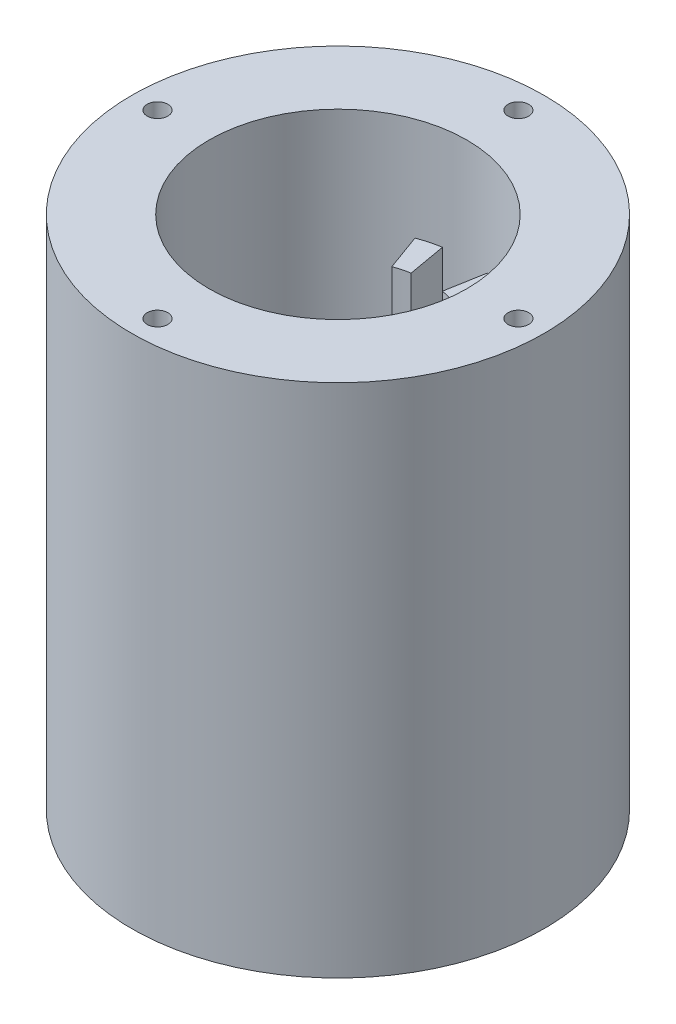
ISO-10303-21;
HEADER;
FILE_DESCRIPTION(('STEP AP214'),'2;1');
FILE_NAME('part.step','',(''),(''),'','','');
FILE_SCHEMA(('AUTOMOTIVE_DESIGN { 1 0 10303 214 1 1 1 1 }'));
ENDSEC;
DATA;
#1=APPLICATION_CONTEXT('core data for automotive mechanical design processes');
#2=APPLICATION_PROTOCOL_DEFINITION('international standard','automotive_design',2000,#1);
#3=PRODUCT_CONTEXT('',#1,'mechanical');
#4=PRODUCT('Part','Part','',(#3));
#5=PRODUCT_RELATED_PRODUCT_CATEGORY('part','',(#4));
#6=PRODUCT_DEFINITION_FORMATION('','',#4);
#7=PRODUCT_DEFINITION_CONTEXT('part definition',#1,'design');
#8=PRODUCT_DEFINITION('design','',#6,#7);
#9=PRODUCT_DEFINITION_SHAPE('','',#8);
#10=(LENGTH_UNIT() NAMED_UNIT(*) SI_UNIT(.MILLI.,.METRE.));
#11=(NAMED_UNIT(*) PLANE_ANGLE_UNIT() SI_UNIT($,.RADIAN.));
#12=(NAMED_UNIT(*) SI_UNIT($,.STERADIAN.) SOLID_ANGLE_UNIT());
#13=UNCERTAINTY_MEASURE_WITH_UNIT(LENGTH_MEASURE(1.E-05),#10,'distance_accuracy_value','');
#14=(GEOMETRIC_REPRESENTATION_CONTEXT(3) GLOBAL_UNCERTAINTY_ASSIGNED_CONTEXT((#13)) GLOBAL_UNIT_ASSIGNED_CONTEXT((#10,
#11,#12)) REPRESENTATION_CONTEXT('',''));
#15=CARTESIAN_POINT('',(0.,0.,0.));
#16=DIRECTION('',(0.,0.,1.));
#17=DIRECTION('',(1.,0.,0.));
#18=AXIS2_PLACEMENT_3D('',#15,#16,#17);
#19=CARTESIAN_POINT('',(0.,50.,0.));
#20=DIRECTION('',(0.,-1.,0.));
#21=DIRECTION('',(0.,0.,-1.));
#22=AXIS2_PLACEMENT_3D('',#19,#20,#21);
#23=CYLINDRICAL_SURFACE('',#22,25.);
#24=CARTESIAN_POINT('',(0.,50.,0.));
#25=DIRECTION('',(0.,1.,0.));
#26=DIRECTION('',(0.,0.,1.));
#27=AXIS2_PLACEMENT_3D('',#24,#25,#26);
#28=CIRCLE('',#27,25.);
#29=CARTESIAN_POINT('',(0.,50.,25.));
#30=VERTEX_POINT('',#29);
#31=EDGE_CURVE('E334',#30,#30,#28,.T.);
#32=ORIENTED_EDGE('',*,*,#31,.T.);
#33=EDGE_LOOP('',(#32));
#34=FACE_BOUND('',#33,.T.);
#35=CARTESIAN_POINT('',(0.,-50.,0.));
#36=DIRECTION('',(0.,1.,0.));
#37=DIRECTION('',(0.,0.,1.));
#38=AXIS2_PLACEMENT_3D('',#35,#36,#37);
#39=CIRCLE('',#38,25.);
#40=CARTESIAN_POINT('',(0.,-50.,25.));
#41=VERTEX_POINT('',#40);
#42=EDGE_CURVE('E313',#41,#41,#39,.T.);
#43=ORIENTED_EDGE('',*,*,#42,.F.);
#44=EDGE_LOOP('',(#43));
#45=FACE_BOUND('',#44,.T.);
#46=DIRECTION('',(0.,-1.,0.));
#47=VECTOR('',#46,1.);
#48=CARTESIAN_POINT('',(-4.34120444167328,30.,24.6201938253052));
#49=LINE('',#48,#47);
#50=CARTESIAN_POINT('',(-4.34120444167328,30.,24.6201938253052));
#51=VERTEX_POINT('',#50);
#52=CARTESIAN_POINT('',(-4.34120444167328,-20.,24.6201938253052));
#53=VERTEX_POINT('',#52);
#54=EDGE_CURVE('E282',#51,#53,#49,.T.);
#55=ORIENTED_EDGE('',*,*,#54,.F.);
#56=CARTESIAN_POINT('',(0.,30.,0.));
#57=DIRECTION('',(0.,-1.,0.));
#58=DIRECTION('',(0.,0.,-1.));
#59=AXIS2_PLACEMENT_3D('',#56,#57,#58);
#60=CIRCLE('',#59,25.);
#61=CARTESIAN_POINT('',(-8.55050358314176,30.,23.4923155196477));
#62=VERTEX_POINT('',#61);
#63=EDGE_CURVE('E260',#62,#51,#60,.F.);
#64=ORIENTED_EDGE('',*,*,#63,.F.);
#65=DIRECTION('',(0.,-1.,0.));
#66=VECTOR('',#65,1.);
#67=CARTESIAN_POINT('',(-8.55050358314176,30.,23.4923155196477));
#68=LINE('',#67,#66);
#69=CARTESIAN_POINT('',(-8.55050358314176,-20.,23.4923155196477));
#70=VERTEX_POINT('',#69);
#71=EDGE_CURVE('E280',#62,#70,#68,.T.);
#72=ORIENTED_EDGE('',*,*,#71,.T.);
#73=CARTESIAN_POINT('',(0.,-20.,0.));
#74=DIRECTION('',(0.,-1.,0.));
#75=DIRECTION('',(0.,0.,-1.));
#76=AXIS2_PLACEMENT_3D('',#73,#74,#75);
#77=CIRCLE('',#76,25.);
#78=EDGE_CURVE('E272',#70,#53,#77,.F.);
#79=ORIENTED_EDGE('',*,*,#78,.T.);
#80=EDGE_LOOP('',(#55,#64,#72,#79));
#81=FACE_BOUND('',#80,.T.);
#82=DIRECTION('',(0.,-1.,0.));
#83=VECTOR('',#82,1.);
#84=CARTESIAN_POINT('',(8.55050358314174,30.,23.4923155196477));
#85=LINE('',#84,#83);
#86=CARTESIAN_POINT('',(8.55050358314173,30.,23.4923155196477));
#87=VERTEX_POINT('',#86);
#88=CARTESIAN_POINT('',(8.55050358314174,-20.,23.4923155196477));
#89=VERTEX_POINT('',#88);
#90=EDGE_CURVE('E249',#87,#89,#85,.T.);
#91=ORIENTED_EDGE('',*,*,#90,.F.);
#92=CARTESIAN_POINT('',(0.,30.,0.));
#93=DIRECTION('',(0.,-1.,0.));
#94=DIRECTION('',(0.,0.,-1.));
#95=AXIS2_PLACEMENT_3D('',#92,#93,#94);
#96=CIRCLE('',#95,25.);
#97=CARTESIAN_POINT('',(4.34120444167327,30.,24.6201938253052));
#98=VERTEX_POINT('',#97);
#99=EDGE_CURVE('E227',#98,#87,#96,.F.);
#100=ORIENTED_EDGE('',*,*,#99,.F.);
#101=DIRECTION('',(0.,-1.,0.));
#102=VECTOR('',#101,1.);
#103=CARTESIAN_POINT('',(4.34120444167327,30.,24.6201938253052));
#104=LINE('',#103,#102);
#105=CARTESIAN_POINT('',(4.34120444167327,-20.,24.6201938253052));
#106=VERTEX_POINT('',#105);
#107=EDGE_CURVE('E247',#98,#106,#104,.T.);
#108=ORIENTED_EDGE('',*,*,#107,.T.);
#109=CARTESIAN_POINT('',(0.,-20.,0.));
#110=DIRECTION('',(0.,-1.,0.));
#111=DIRECTION('',(0.,0.,-1.));
#112=AXIS2_PLACEMENT_3D('',#109,#110,#111);
#113=CIRCLE('',#112,25.);
#114=EDGE_CURVE('E239',#106,#89,#113,.F.);
#115=ORIENTED_EDGE('',*,*,#114,.T.);
#116=EDGE_LOOP('',(#91,#100,#108,#115));
#117=FACE_BOUND('',#116,.T.);
#118=DIRECTION('',(0.,-1.,0.));
#119=VECTOR('',#118,1.);
#120=CARTESIAN_POINT('',(-8.55050358314176,30.,-23.4923155196477));
#121=LINE('',#120,#119);
#122=CARTESIAN_POINT('',(-8.55050358314176,30.,-23.4923155196477));
#123=VERTEX_POINT('',#122);
#124=CARTESIAN_POINT('',(-8.55050358314176,-20.,-23.4923155196477));
#125=VERTEX_POINT('',#124);
#126=EDGE_CURVE('E216',#123,#125,#121,.T.);
#127=ORIENTED_EDGE('',*,*,#126,.F.);
#128=CARTESIAN_POINT('',(0.,30.,0.));
#129=DIRECTION('',(0.,1.,0.));
#130=DIRECTION('',(0.,0.,1.));
#131=AXIS2_PLACEMENT_3D('',#128,#129,#130);
#132=CIRCLE('',#131,25.);
#133=CARTESIAN_POINT('',(-4.34120444167328,30.,-24.6201938253052));
#134=VERTEX_POINT('',#133);
#135=EDGE_CURVE('E195',#123,#134,#132,.F.);
#136=ORIENTED_EDGE('',*,*,#135,.T.);
#137=DIRECTION('',(0.,-1.,0.));
#138=VECTOR('',#137,1.);
#139=CARTESIAN_POINT('',(-4.34120444167328,30.,-24.6201938253052));
#140=LINE('',#139,#138);
#141=CARTESIAN_POINT('',(-4.34120444167328,-20.,-24.6201938253052));
#142=VERTEX_POINT('',#141);
#143=EDGE_CURVE('E214',#134,#142,#140,.T.);
#144=ORIENTED_EDGE('',*,*,#143,.T.);
#145=CARTESIAN_POINT('',(0.,-20.,0.));
#146=DIRECTION('',(0.,1.,0.));
#147=DIRECTION('',(0.,0.,1.));
#148=AXIS2_PLACEMENT_3D('',#145,#146,#147);
#149=CIRCLE('',#148,25.);
#150=EDGE_CURVE('E206',#125,#142,#149,.F.);
#151=ORIENTED_EDGE('',*,*,#150,.F.);
#152=EDGE_LOOP('',(#127,#136,#144,#151));
#153=FACE_BOUND('',#152,.T.);
#154=DIRECTION('',(0.,-1.,0.));
#155=VECTOR('',#154,1.);
#156=CARTESIAN_POINT('',(4.34120444167327,30.,-24.6201938253052));
#157=LINE('',#156,#155);
#158=CARTESIAN_POINT('',(4.34120444167327,30.,-24.6201938253052));
#159=VERTEX_POINT('',#158);
#160=CARTESIAN_POINT('',(4.34120444167327,-20.,-24.6201938253052));
#161=VERTEX_POINT('',#160);
#162=EDGE_CURVE('E59',#159,#161,#157,.T.);
#163=ORIENTED_EDGE('',*,*,#162,.F.);
#164=CARTESIAN_POINT('',(0.,30.,0.));
#165=DIRECTION('',(0.,1.,0.));
#166=DIRECTION('',(0.,0.,1.));
#167=AXIS2_PLACEMENT_3D('',#164,#165,#166);
#168=CIRCLE('',#167,25.);
#169=CARTESIAN_POINT('',(8.55050358314173,30.,-23.4923155196477));
#170=VERTEX_POINT('',#169);
#171=EDGE_CURVE('E54',#159,#170,#168,.F.);
#172=ORIENTED_EDGE('',*,*,#171,.T.);
#173=DIRECTION('',(0.,-1.,0.));
#174=VECTOR('',#173,1.);
#175=CARTESIAN_POINT('',(8.55050358314174,30.,-23.4923155196477));
#176=LINE('',#175,#174);
#177=CARTESIAN_POINT('',(8.55050358314174,-20.,-23.4923155196477));
#178=VERTEX_POINT('',#177);
#179=EDGE_CURVE('E185',#170,#178,#176,.T.);
#180=ORIENTED_EDGE('',*,*,#179,.T.);
#181=CARTESIAN_POINT('',(0.,-20.,0.));
#182=DIRECTION('',(0.,1.,0.));
#183=DIRECTION('',(0.,0.,1.));
#184=AXIS2_PLACEMENT_3D('',#181,#182,#183);
#185=CIRCLE('',#184,25.);
#186=EDGE_CURVE('E173',#161,#178,#185,.F.);
#187=ORIENTED_EDGE('',*,*,#186,.F.);
#188=EDGE_LOOP('',(#163,#172,#180,#187));
#189=FACE_BOUND('',#188,.T.);
#190=ADVANCED_FACE('F39',(#34,#45,#81,#117,#153,#189),#23,.F.);
#191=CARTESIAN_POINT('',(0.,50.,0.));
#192=DIRECTION('',(0.,1.,0.));
#193=DIRECTION('',(0.,0.,1.));
#194=AXIS2_PLACEMENT_3D('',#191,#192,#193);
#195=PLANE('',#194);
#196=CARTESIAN_POINT('',(0.,50.,-35.));
#197=DIRECTION('',(0.,1.,0.));
#198=DIRECTION('',(0.,0.,1.));
#199=AXIS2_PLACEMENT_3D('',#196,#197,#198);
#200=CIRCLE('',#199,2.);
#201=CARTESIAN_POINT('',(0.,50.,-33.));
#202=VERTEX_POINT('',#201);
#203=EDGE_CURVE('E314',#202,#202,#200,.T.);
#204=ORIENTED_EDGE('',*,*,#203,.F.);
#205=EDGE_LOOP('',(#204));
#206=FACE_BOUND('',#205,.T.);
#207=CARTESIAN_POINT('',(35.000000000001,50.,-9.88330434368617E-13));
#208=DIRECTION('',(0.,1.,0.));
#209=DIRECTION('',(0.,0.,1.));
#210=AXIS2_PLACEMENT_3D('',#207,#208,#209);
#211=CIRCLE('',#210,2.00000000000077);
#212=CARTESIAN_POINT('',(35.000000000001,50.,1.99999999999978));
#213=VERTEX_POINT('',#212);
#214=EDGE_CURVE('E317',#213,#213,#211,.T.);
#215=ORIENTED_EDGE('',*,*,#214,.F.);
#216=EDGE_LOOP('',(#215));
#217=FACE_BOUND('',#216,.T.);
#218=CARTESIAN_POINT('',(1.97666086873723E-12,50.,35.));
#219=DIRECTION('',(0.,1.,0.));
#220=DIRECTION('',(0.,0.,1.));
#221=AXIS2_PLACEMENT_3D('',#218,#219,#220);
#222=CIRCLE('',#221,2.00000000000212);
#223=CARTESIAN_POINT('',(1.97666086873723E-12,50.,37.0000000000021));
#224=VERTEX_POINT('',#223);
#225=EDGE_CURVE('E323',#224,#224,#222,.T.);
#226=ORIENTED_EDGE('',*,*,#225,.F.);
#227=EDGE_LOOP('',(#226));
#228=FACE_BOUND('',#227,.T.);
#229=CARTESIAN_POINT('',(-34.999999999999,50.,9.92616698165632E-13));
#230=DIRECTION('',(0.,1.,0.));
#231=DIRECTION('',(0.,0.,1.));
#232=AXIS2_PLACEMENT_3D('',#229,#230,#231);
#233=CIRCLE('',#232,2.00000000000159);
#234=CARTESIAN_POINT('',(-34.999999999999,50.,2.00000000000258));
#235=VERTEX_POINT('',#234);
#236=EDGE_CURVE('E329',#235,#235,#233,.T.);
#237=ORIENTED_EDGE('',*,*,#236,.F.);
#238=EDGE_LOOP('',(#237));
#239=FACE_BOUND('',#238,.T.);
#240=CARTESIAN_POINT('',(0.,50.,0.));
#241=DIRECTION('',(0.,1.,0.));
#242=DIRECTION('',(0.,0.,1.));
#243=AXIS2_PLACEMENT_3D('',#240,#241,#242);
#244=CIRCLE('',#243,40.);
#245=CARTESIAN_POINT('',(0.,50.,-40.));
#246=VERTEX_POINT('',#245);
#247=EDGE_CURVE('E11',#246,#246,#244,.T.);
#248=ORIENTED_EDGE('',*,*,#247,.T.);
#249=EDGE_LOOP('',(#248));
#250=FACE_BOUND('',#249,.T.);
#251=ORIENTED_EDGE('',*,*,#31,.F.);
#252=EDGE_LOOP('',(#251));
#253=FACE_BOUND('',#252,.T.);
#254=ADVANCED_FACE('F344',(#206,#217,#228,#239,#250,#253),#195,.T.);
#255=CARTESIAN_POINT('',(0.,-50.,0.));
#256=DIRECTION('',(0.,1.,0.));
#257=DIRECTION('',(0.,0.,1.));
#258=AXIS2_PLACEMENT_3D('',#255,#256,#257);
#259=PLANE('',#258);
#260=CARTESIAN_POINT('',(0.,-50.,-35.));
#261=DIRECTION('',(0.,1.,0.));
#262=DIRECTION('',(0.,0.,1.));
#263=AXIS2_PLACEMENT_3D('',#260,#261,#262);
#264=CIRCLE('',#263,2.);
#265=CARTESIAN_POINT('',(0.,-50.,-33.));
#266=VERTEX_POINT('',#265);
#267=EDGE_CURVE('E290',#266,#266,#264,.T.);
#268=ORIENTED_EDGE('',*,*,#267,.T.);
#269=EDGE_LOOP('',(#268));
#270=FACE_BOUND('',#269,.T.);
#271=CARTESIAN_POINT('',(35.000000000001,-50.,-9.88330434368617E-13));
#272=DIRECTION('',(0.,1.,0.));
#273=DIRECTION('',(0.,0.,1.));
#274=AXIS2_PLACEMENT_3D('',#271,#272,#273);
#275=CIRCLE('',#274,2.00000000000077);
#276=CARTESIAN_POINT('',(35.000000000001,-50.,1.99999999999978));
#277=VERTEX_POINT('',#276);
#278=EDGE_CURVE('E296',#277,#277,#275,.T.);
#279=ORIENTED_EDGE('',*,*,#278,.T.);
#280=EDGE_LOOP('',(#279));
#281=FACE_BOUND('',#280,.T.);
#282=CARTESIAN_POINT('',(1.97666086873723E-12,-50.,35.));
#283=DIRECTION('',(0.,1.,0.));
#284=DIRECTION('',(0.,0.,1.));
#285=AXIS2_PLACEMENT_3D('',#282,#283,#284);
#286=CIRCLE('',#285,2.00000000000212);
#287=CARTESIAN_POINT('',(1.97666086873723E-12,-50.,37.0000000000021));
#288=VERTEX_POINT('',#287);
#289=EDGE_CURVE('E302',#288,#288,#286,.T.);
#290=ORIENTED_EDGE('',*,*,#289,.T.);
#291=EDGE_LOOP('',(#290));
#292=FACE_BOUND('',#291,.T.);
#293=CARTESIAN_POINT('',(-34.999999999999,-50.,9.92616698165632E-13));
#294=DIRECTION('',(0.,1.,0.));
#295=DIRECTION('',(0.,0.,1.));
#296=AXIS2_PLACEMENT_3D('',#293,#294,#295);
#297=CIRCLE('',#296,2.00000000000159);
#298=CARTESIAN_POINT('',(-34.999999999999,-50.,2.00000000000258));
#299=VERTEX_POINT('',#298);
#300=EDGE_CURVE('E279',#299,#299,#297,.T.);
#301=ORIENTED_EDGE('',*,*,#300,.T.);
#302=EDGE_LOOP('',(#301));
#303=FACE_BOUND('',#302,.T.);
#304=CARTESIAN_POINT('',(0.,-50.,0.));
#305=DIRECTION('',(0.,1.,0.));
#306=DIRECTION('',(0.,0.,1.));
#307=AXIS2_PLACEMENT_3D('',#304,#305,#306);
#308=CIRCLE('',#307,40.);
#309=CARTESIAN_POINT('',(0.,-50.,-40.));
#310=VERTEX_POINT('',#309);
#311=EDGE_CURVE('E43',#310,#310,#308,.T.);
#312=ORIENTED_EDGE('',*,*,#311,.F.);
#313=EDGE_LOOP('',(#312));
#314=FACE_BOUND('',#313,.T.);
#315=ORIENTED_EDGE('',*,*,#42,.T.);
#316=EDGE_LOOP('',(#315));
#317=FACE_BOUND('',#316,.T.);
#318=ADVANCED_FACE('F340',(#270,#281,#292,#303,#314,#317),#259,.F.);
#319=CARTESIAN_POINT('',(0.,50.,0.));
#320=DIRECTION('',(0.,-1.,0.));
#321=DIRECTION('',(0.,0.,-1.));
#322=AXIS2_PLACEMENT_3D('',#319,#320,#321);
#323=CYLINDRICAL_SURFACE('',#322,40.);
#324=CARTESIAN_POINT('',(0.,50.,-40.));
#325=CARTESIAN_POINT('',(0.,48.9583333333333,-40.));
#326=CARTESIAN_POINT('',(0.,47.9166666666667,-40.));
#327=CARTESIAN_POINT('',(0.,45.8333333333333,-40.));
#328=CARTESIAN_POINT('',(0.,44.7916666666667,-40.));
#329=CARTESIAN_POINT('',(0.,42.7083333333333,-40.));
#330=CARTESIAN_POINT('',(0.,41.6666666666667,-40.));
#331=CARTESIAN_POINT('',(0.,39.5833333333333,-40.));
#332=CARTESIAN_POINT('',(0.,38.5416666666667,-40.));
#333=CARTESIAN_POINT('',(0.,36.4583333333333,-40.));
#334=CARTESIAN_POINT('',(0.,35.4166666666667,-40.));
#335=CARTESIAN_POINT('',(0.,33.3333333333333,-40.));
#336=CARTESIAN_POINT('',(0.,32.2916666666667,-40.));
#337=CARTESIAN_POINT('',(0.,30.2083333333333,-40.));
#338=CARTESIAN_POINT('',(0.,29.1666666666667,-40.));
#339=CARTESIAN_POINT('',(0.,27.0833333333333,-40.));
#340=CARTESIAN_POINT('',(0.,26.0416666666667,-40.));
#341=CARTESIAN_POINT('',(0.,23.9583333333333,-40.));
#342=CARTESIAN_POINT('',(0.,22.9166666666667,-40.));
#343=CARTESIAN_POINT('',(0.,20.8333333333333,-40.));
#344=CARTESIAN_POINT('',(0.,19.7916666666667,-40.));
#345=CARTESIAN_POINT('',(0.,17.7083333333333,-40.));
#346=CARTESIAN_POINT('',(0.,16.6666666666667,-40.));
#347=CARTESIAN_POINT('',(0.,14.5833333333333,-40.));
#348=CARTESIAN_POINT('',(0.,13.5416666666667,-40.));
#349=CARTESIAN_POINT('',(0.,11.4583333333333,-40.));
#350=CARTESIAN_POINT('',(0.,10.4166666666667,-40.));
#351=CARTESIAN_POINT('',(0.,8.33333333333333,-40.));
#352=CARTESIAN_POINT('',(0.,7.29166666666666,-40.));
#353=CARTESIAN_POINT('',(0.,5.20833333333333,-40.));
#354=CARTESIAN_POINT('',(0.,4.16666666666666,-40.));
#355=CARTESIAN_POINT('',(0.,2.08333333333333,-40.));
#356=CARTESIAN_POINT('',(0.,1.04166666666666,-40.));
#357=CARTESIAN_POINT('',(0.,-1.04166666666667,-40.));
#358=CARTESIAN_POINT('',(0.,-2.08333333333334,-40.));
#359=CARTESIAN_POINT('',(0.,-4.16666666666667,-40.));
#360=CARTESIAN_POINT('',(0.,-5.20833333333334,-40.));
#361=CARTESIAN_POINT('',(0.,-7.29166666666667,-40.));
#362=CARTESIAN_POINT('',(0.,-8.33333333333334,-40.));
#363=CARTESIAN_POINT('',(0.,-10.4166666666667,-40.));
#364=CARTESIAN_POINT('',(0.,-11.4583333333333,-40.));
#365=CARTESIAN_POINT('',(0.,-13.5416666666667,-40.));
#366=CARTESIAN_POINT('',(0.,-14.5833333333333,-40.));
#367=CARTESIAN_POINT('',(0.,-16.6666666666667,-40.));
#368=CARTESIAN_POINT('',(0.,-17.7083333333333,-40.));
#369=CARTESIAN_POINT('',(0.,-19.7916666666667,-40.));
#370=CARTESIAN_POINT('',(0.,-20.8333333333333,-40.));
#371=CARTESIAN_POINT('',(0.,-22.9166666666667,-40.));
#372=CARTESIAN_POINT('',(0.,-23.9583333333333,-40.));
#373=CARTESIAN_POINT('',(0.,-26.0416666666667,-40.));
#374=CARTESIAN_POINT('',(0.,-27.0833333333333,-40.));
#375=CARTESIAN_POINT('',(0.,-29.1666666666667,-40.));
#376=CARTESIAN_POINT('',(0.,-30.2083333333333,-40.));
#377=CARTESIAN_POINT('',(0.,-32.2916666666667,-40.));
#378=CARTESIAN_POINT('',(0.,-33.3333333333333,-40.));
#379=CARTESIAN_POINT('',(0.,-35.4166666666667,-40.));
#380=CARTESIAN_POINT('',(0.,-36.4583333333333,-40.));
#381=CARTESIAN_POINT('',(0.,-38.5416666666667,-40.));
#382=CARTESIAN_POINT('',(0.,-39.5833333333333,-40.));
#383=CARTESIAN_POINT('',(0.,-41.6666666666667,-40.));
#384=CARTESIAN_POINT('',(0.,-42.7083333333333,-40.));
#385=CARTESIAN_POINT('',(0.,-44.7916666666667,-40.));
#386=CARTESIAN_POINT('',(0.,-45.8333333333333,-40.));
#387=CARTESIAN_POINT('',(0.,-47.9166666666667,-40.));
#388=CARTESIAN_POINT('',(0.,-48.9583333333333,-40.));
#389=CARTESIAN_POINT('',(0.,-50.,-40.));
#390=B_SPLINE_CURVE_WITH_KNOTS('',3,(#324,#325,#326,#327,#328,#329,#330,#331,#332,#333,#334,
#335,#336,#337,#338,#339,#340,#341,#342,#343,#344,#345,#346,#347,#348,#349,#350,#351,#352,#353,
#354,#355,#356,#357,#358,#359,#360,#361,#362,#363,#364,#365,#366,#367,#368,#369,#370,#371,#372,
#373,#374,#375,#376,#377,#378,#379,#380,#381,#382,#383,#384,#385,#386,#387,#388,#389),
.UNSPECIFIED.,.F.,.F.,(4,2,2,2,2,2,2,2,2,2,2,2,2,2,2,2,2,2,2,2,2,2,2,2,2,2,2,2,2,2,2,2,4),(0.,
3.125,6.25,9.37499999999999,12.5,15.625,18.75,21.875,25.,28.125,31.25,34.375,37.5,40.625,43.75,
46.875,50.,53.125,56.25,59.375,62.5,65.625,68.75,71.875,75.,78.125,81.25,84.375,87.5,90.625,
93.75,96.875,100.),.UNSPECIFIED.);
#391=EDGE_CURVE('BSEAM41',#246,#310,#390,.T.);
#392=ORIENTED_EDGE('',*,*,#247,.F.);
#393=ORIENTED_EDGE('',*,*,#311,.T.);
#394=ORIENTED_EDGE('',*,*,#391,.T.);
#395=ORIENTED_EDGE('',*,*,#391,.F.);
#396=EDGE_LOOP('',(#392,#394,#393,#395));
#397=FACE_BOUND('',#396,.T.);
#398=ADVANCED_FACE('F41',(#397),#323,.T.);
#399=CARTESIAN_POINT('',(-34.999999999999,40.,9.92616698165632E-13));
#400=DIRECTION('',(0.,1.,0.));
#401=DIRECTION('',(0.,0.,1.));
#402=AXIS2_PLACEMENT_3D('',#399,#400,#401);
#403=CYLINDRICAL_SURFACE('',#402,2.00000000000159);
#404=CARTESIAN_POINT('',(-34.999999999999,40.,9.92616698165632E-13));
#405=DIRECTION('',(0.,1.,0.));
#406=DIRECTION('',(0.,0.,1.));
#407=AXIS2_PLACEMENT_3D('',#404,#405,#406);
#408=CIRCLE('',#407,2.00000000000159);
#409=CARTESIAN_POINT('',(-34.999999999999,40.,2.00000000000258));
#410=VERTEX_POINT('',#409);
#411=EDGE_CURVE('E289',#410,#410,#408,.T.);
#412=ORIENTED_EDGE('',*,*,#411,.F.);
#413=EDGE_LOOP('',(#412));
#414=FACE_BOUND('',#413,.T.);
#415=ORIENTED_EDGE('',*,*,#236,.T.);
#416=EDGE_LOOP('',(#415));
#417=FACE_BOUND('',#416,.T.);
#418=ADVANCED_FACE('F480',(#414,#417),#403,.F.);
#419=CARTESIAN_POINT('',(-34.999999999999,40.,9.92616698165632E-13));
#420=DIRECTION('',(0.,1.,0.));
#421=DIRECTION('',(0.,0.,1.));
#422=AXIS2_PLACEMENT_3D('',#419,#420,#421);
#423=PLANE('',#422);
#424=ORIENTED_EDGE('',*,*,#411,.T.);
#425=EDGE_LOOP('',(#424));
#426=FACE_BOUND('',#425,.T.);
#427=ADVANCED_FACE('F475',(#426),#423,.T.);
#428=CARTESIAN_POINT('',(1.97666086873723E-12,40.,35.));
#429=DIRECTION('',(0.,1.,0.));
#430=DIRECTION('',(0.,0.,1.));
#431=AXIS2_PLACEMENT_3D('',#428,#429,#430);
#432=CYLINDRICAL_SURFACE('',#431,2.00000000000212);
#433=CARTESIAN_POINT('',(1.97666086873723E-12,40.,35.));
#434=DIRECTION('',(0.,1.,0.));
#435=DIRECTION('',(0.,0.,1.));
#436=AXIS2_PLACEMENT_3D('',#433,#434,#435);
#437=CIRCLE('',#436,2.00000000000212);
#438=CARTESIAN_POINT('',(1.97666086873723E-12,40.,37.0000000000021));
#439=VERTEX_POINT('',#438);
#440=EDGE_CURVE('E326',#439,#439,#437,.T.);
#441=ORIENTED_EDGE('',*,*,#440,.F.);
#442=EDGE_LOOP('',(#441));
#443=FACE_BOUND('',#442,.T.);
#444=ORIENTED_EDGE('',*,*,#225,.T.);
#445=EDGE_LOOP('',(#444));
#446=FACE_BOUND('',#445,.T.);
#447=ADVANCED_FACE('F472',(#443,#446),#432,.F.);
#448=CARTESIAN_POINT('',(1.97666086873723E-12,40.,35.));
#449=DIRECTION('',(0.,1.,0.));
#450=DIRECTION('',(0.,0.,1.));
#451=AXIS2_PLACEMENT_3D('',#448,#449,#450);
#452=PLANE('',#451);
#453=ORIENTED_EDGE('',*,*,#440,.T.);
#454=EDGE_LOOP('',(#453));
#455=FACE_BOUND('',#454,.T.);
#456=ADVANCED_FACE('F467',(#455),#452,.T.);
#457=CARTESIAN_POINT('',(35.000000000001,40.,-9.88330434368617E-13));
#458=DIRECTION('',(0.,1.,0.));
#459=DIRECTION('',(0.,0.,1.));
#460=AXIS2_PLACEMENT_3D('',#457,#458,#459);
#461=CYLINDRICAL_SURFACE('',#460,2.00000000000077);
#462=CARTESIAN_POINT('',(35.000000000001,40.,-9.88330434368617E-13));
#463=DIRECTION('',(0.,1.,0.));
#464=DIRECTION('',(0.,0.,1.));
#465=AXIS2_PLACEMENT_3D('',#462,#463,#464);
#466=CIRCLE('',#465,2.00000000000077);
#467=CARTESIAN_POINT('',(35.000000000001,40.,1.99999999999978));
#468=VERTEX_POINT('',#467);
#469=EDGE_CURVE('E320',#468,#468,#466,.T.);
#470=ORIENTED_EDGE('',*,*,#469,.F.);
#471=EDGE_LOOP('',(#470));
#472=FACE_BOUND('',#471,.T.);
#473=ORIENTED_EDGE('',*,*,#214,.T.);
#474=EDGE_LOOP('',(#473));
#475=FACE_BOUND('',#474,.T.);
#476=ADVANCED_FACE('F464',(#472,#475),#461,.F.);
#477=CARTESIAN_POINT('',(35.000000000001,40.,-9.88330434368617E-13));
#478=DIRECTION('',(0.,1.,0.));
#479=DIRECTION('',(0.,0.,1.));
#480=AXIS2_PLACEMENT_3D('',#477,#478,#479);
#481=PLANE('',#480);
#482=ORIENTED_EDGE('',*,*,#469,.T.);
#483=EDGE_LOOP('',(#482));
#484=FACE_BOUND('',#483,.T.);
#485=ADVANCED_FACE('F462',(#484),#481,.T.);
#486=CARTESIAN_POINT('',(0.,40.,-35.));
#487=DIRECTION('',(0.,1.,0.));
#488=DIRECTION('',(0.,0.,1.));
#489=AXIS2_PLACEMENT_3D('',#486,#487,#488);
#490=CYLINDRICAL_SURFACE('',#489,2.);
#491=CARTESIAN_POINT('',(0.,40.,-35.));
#492=DIRECTION('',(0.,1.,0.));
#493=DIRECTION('',(0.,0.,1.));
#494=AXIS2_PLACEMENT_3D('',#491,#492,#493);
#495=CIRCLE('',#494,2.);
#496=CARTESIAN_POINT('',(0.,40.,-33.));
#497=VERTEX_POINT('',#496);
#498=EDGE_CURVE('E310',#497,#497,#495,.T.);
#499=ORIENTED_EDGE('',*,*,#498,.F.);
#500=EDGE_LOOP('',(#499));
#501=FACE_BOUND('',#500,.T.);
#502=ORIENTED_EDGE('',*,*,#203,.T.);
#503=EDGE_LOOP('',(#502));
#504=FACE_BOUND('',#503,.T.);
#505=ADVANCED_FACE('F458',(#501,#504),#490,.F.);
#506=CARTESIAN_POINT('',(0.,40.,-35.));
#507=DIRECTION('',(0.,1.,0.));
#508=DIRECTION('',(0.,0.,1.));
#509=AXIS2_PLACEMENT_3D('',#506,#507,#508);
#510=PLANE('',#509);
#511=ORIENTED_EDGE('',*,*,#498,.T.);
#512=EDGE_LOOP('',(#511));
#513=FACE_BOUND('',#512,.T.);
#514=ADVANCED_FACE('F454',(#513),#510,.T.);
#515=CARTESIAN_POINT('',(-34.999999999999,-40.,9.92616698165632E-13));
#516=DIRECTION('',(0.,-1.,0.));
#517=DIRECTION('',(0.,0.,-1.));
#518=AXIS2_PLACEMENT_3D('',#515,#516,#517);
#519=CYLINDRICAL_SURFACE('',#518,2.00000000000159);
#520=CARTESIAN_POINT('',(-34.999999999999,-40.,9.92616698165632E-13));
#521=DIRECTION('',(0.,1.,0.));
#522=DIRECTION('',(0.,0.,1.));
#523=AXIS2_PLACEMENT_3D('',#520,#521,#522);
#524=CIRCLE('',#523,2.00000000000159);
#525=CARTESIAN_POINT('',(-34.999999999999,-40.,2.00000000000258));
#526=VERTEX_POINT('',#525);
#527=EDGE_CURVE('E305',#526,#526,#524,.T.);
#528=ORIENTED_EDGE('',*,*,#527,.T.);
#529=EDGE_LOOP('',(#528));
#530=FACE_BOUND('',#529,.T.);
#531=ORIENTED_EDGE('',*,*,#300,.F.);
#532=EDGE_LOOP('',(#531));
#533=FACE_BOUND('',#532,.T.);
#534=ADVANCED_FACE('F450',(#530,#533),#519,.F.);
#535=CARTESIAN_POINT('',(-34.999999999999,-40.,9.92616698165632E-13));
#536=DIRECTION('',(0.,-1.,0.));
#537=DIRECTION('',(0.,0.,1.));
#538=AXIS2_PLACEMENT_3D('',#535,#536,#537);
#539=PLANE('',#538);
#540=ORIENTED_EDGE('',*,*,#527,.F.);
#541=EDGE_LOOP('',(#540));
#542=FACE_BOUND('',#541,.T.);
#543=ADVANCED_FACE('F446',(#542),#539,.T.);
#544=CARTESIAN_POINT('',(1.97666086873723E-12,-40.,35.));
#545=DIRECTION('',(0.,-1.,0.));
#546=DIRECTION('',(0.,0.,-1.));
#547=AXIS2_PLACEMENT_3D('',#544,#545,#546);
#548=CYLINDRICAL_SURFACE('',#547,2.00000000000212);
#549=CARTESIAN_POINT('',(1.97666086873723E-12,-40.,35.));
#550=DIRECTION('',(0.,1.,0.));
#551=DIRECTION('',(0.,0.,1.));
#552=AXIS2_PLACEMENT_3D('',#549,#550,#551);
#553=CIRCLE('',#552,2.00000000000212);
#554=CARTESIAN_POINT('',(1.97666086873723E-12,-40.,37.0000000000021));
#555=VERTEX_POINT('',#554);
#556=EDGE_CURVE('E299',#555,#555,#553,.T.);
#557=ORIENTED_EDGE('',*,*,#556,.T.);
#558=EDGE_LOOP('',(#557));
#559=FACE_BOUND('',#558,.T.);
#560=ORIENTED_EDGE('',*,*,#289,.F.);
#561=EDGE_LOOP('',(#560));
#562=FACE_BOUND('',#561,.T.);
#563=ADVANCED_FACE('F442',(#559,#562),#548,.F.);
#564=CARTESIAN_POINT('',(1.97666086873723E-12,-40.,35.));
#565=DIRECTION('',(0.,-1.,0.));
#566=DIRECTION('',(0.,0.,1.));
#567=AXIS2_PLACEMENT_3D('',#564,#565,#566);
#568=PLANE('',#567);
#569=ORIENTED_EDGE('',*,*,#556,.F.);
#570=EDGE_LOOP('',(#569));
#571=FACE_BOUND('',#570,.T.);
#572=ADVANCED_FACE('F438',(#571),#568,.T.);
#573=CARTESIAN_POINT('',(35.000000000001,-40.,-9.88330434368617E-13));
#574=DIRECTION('',(0.,-1.,0.));
#575=DIRECTION('',(0.,0.,-1.));
#576=AXIS2_PLACEMENT_3D('',#573,#574,#575);
#577=CYLINDRICAL_SURFACE('',#576,2.00000000000077);
#578=CARTESIAN_POINT('',(35.000000000001,-40.,-9.88330434368617E-13));
#579=DIRECTION('',(0.,1.,0.));
#580=DIRECTION('',(0.,0.,1.));
#581=AXIS2_PLACEMENT_3D('',#578,#579,#580);
#582=CIRCLE('',#581,2.00000000000077);
#583=CARTESIAN_POINT('',(35.000000000001,-40.,1.99999999999978));
#584=VERTEX_POINT('',#583);
#585=EDGE_CURVE('E293',#584,#584,#582,.T.);
#586=ORIENTED_EDGE('',*,*,#585,.T.);
#587=EDGE_LOOP('',(#586));
#588=FACE_BOUND('',#587,.T.);
#589=ORIENTED_EDGE('',*,*,#278,.F.);
#590=EDGE_LOOP('',(#589));
#591=FACE_BOUND('',#590,.T.);
#592=ADVANCED_FACE('F434',(#588,#591),#577,.F.);
#593=CARTESIAN_POINT('',(35.000000000001,-40.,-9.88330434368617E-13));
#594=DIRECTION('',(0.,-1.,0.));
#595=DIRECTION('',(0.,0.,1.));
#596=AXIS2_PLACEMENT_3D('',#593,#594,#595);
#597=PLANE('',#596);
#598=ORIENTED_EDGE('',*,*,#585,.F.);
#599=EDGE_LOOP('',(#598));
#600=FACE_BOUND('',#599,.T.);
#601=ADVANCED_FACE('F430',(#600),#597,.T.);
#602=CARTESIAN_POINT('',(0.,-40.,-35.));
#603=DIRECTION('',(0.,-1.,0.));
#604=DIRECTION('',(0.,0.,-1.));
#605=AXIS2_PLACEMENT_3D('',#602,#603,#604);
#606=CYLINDRICAL_SURFACE('',#605,2.);
#607=CARTESIAN_POINT('',(0.,-40.,-35.));
#608=DIRECTION('',(0.,1.,0.));
#609=DIRECTION('',(0.,0.,1.));
#610=AXIS2_PLACEMENT_3D('',#607,#608,#609);
#611=CIRCLE('',#610,2.);
#612=CARTESIAN_POINT('',(0.,-40.,-33.));
#613=VERTEX_POINT('',#612);
#614=EDGE_CURVE('E286',#613,#613,#611,.T.);
#615=ORIENTED_EDGE('',*,*,#614,.T.);
#616=EDGE_LOOP('',(#615));
#617=FACE_BOUND('',#616,.T.);
#618=ORIENTED_EDGE('',*,*,#267,.F.);
#619=EDGE_LOOP('',(#618));
#620=FACE_BOUND('',#619,.T.);
#621=ADVANCED_FACE('F426',(#617,#620),#606,.F.);
#622=CARTESIAN_POINT('',(0.,-40.,-35.));
#623=DIRECTION('',(0.,-1.,0.));
#624=DIRECTION('',(0.,0.,1.));
#625=AXIS2_PLACEMENT_3D('',#622,#623,#624);
#626=PLANE('',#625);
#627=ORIENTED_EDGE('',*,*,#614,.F.);
#628=EDGE_LOOP('',(#627));
#629=FACE_BOUND('',#628,.T.);
#630=ADVANCED_FACE('F422',(#629),#626,.T.);
#631=CARTESIAN_POINT('',(0.,30.,0.));
#632=DIRECTION('',(0.,-1.,0.));
#633=DIRECTION('',(0.,0.,-1.));
#634=AXIS2_PLACEMENT_3D('',#631,#632,#633);
#635=CYLINDRICAL_SURFACE('',#634,17.5);
#636=CARTESIAN_POINT('',(0.,-20.,0.));
#637=DIRECTION('',(0.,-1.,0.));
#638=DIRECTION('',(0.,0.,-1.));
#639=AXIS2_PLACEMENT_3D('',#636,#637,#638);
#640=CIRCLE('',#639,17.5);
#641=CARTESIAN_POINT('',(-3.0388431091713,-20.,17.2341356777136));
#642=VERTEX_POINT('',#641);
#643=CARTESIAN_POINT('',(-5.98535250819923,-20.,16.4446208637534));
#644=VERTEX_POINT('',#643);
#645=EDGE_CURVE('E246',#642,#644,#640,.T.);
#646=ORIENTED_EDGE('',*,*,#645,.T.);
#647=DIRECTION('',(0.,-1.,0.));
#648=VECTOR('',#647,1.);
#649=CARTESIAN_POINT('',(-5.98535250819923,30.,16.4446208637534));
#650=LINE('',#649,#648);
#651=CARTESIAN_POINT('',(-5.98535250819923,30.,16.4446208637534));
#652=VERTEX_POINT('',#651);
#653=EDGE_CURVE('E276',#652,#644,#650,.T.);
#654=ORIENTED_EDGE('',*,*,#653,.F.);
#655=CARTESIAN_POINT('',(0.,30.,0.));
#656=DIRECTION('',(0.,-1.,0.));
#657=DIRECTION('',(0.,0.,-1.));
#658=AXIS2_PLACEMENT_3D('',#655,#656,#657);
#659=CIRCLE('',#658,17.5);
#660=CARTESIAN_POINT('',(-3.0388431091713,30.,17.2341356777136));
#661=VERTEX_POINT('',#660);
#662=EDGE_CURVE('E253',#661,#652,#659,.T.);
#663=ORIENTED_EDGE('',*,*,#662,.F.);
#664=DIRECTION('',(0.,-1.,0.));
#665=VECTOR('',#664,1.);
#666=CARTESIAN_POINT('',(-3.0388431091713,30.,17.2341356777136));
#667=LINE('',#666,#665);
#668=EDGE_CURVE('E266',#661,#642,#667,.T.);
#669=ORIENTED_EDGE('',*,*,#668,.T.);
#670=EDGE_LOOP('',(#646,#654,#663,#669));
#671=FACE_BOUND('',#670,.T.);
#672=ADVANCED_FACE('F415',(#671),#635,.F.);
#673=CARTESIAN_POINT('',(0.,30.,0.));
#674=DIRECTION('',(0.939692620785908,0.,0.34202014332567));
#675=DIRECTION('',(0.34202014332567,0.,-0.939692620785908));
#676=AXIS2_PLACEMENT_3D('',#673,#674,#675);
#677=PLANE('',#676);
#678=DIRECTION('',(-0.34202014332567,0.,0.939692620785908));
#679=VECTOR('',#678,1.);
#680=CARTESIAN_POINT('',(0.,-20.,0.));
#681=LINE('',#680,#679);
#682=EDGE_CURVE('E257',#644,#70,#681,.T.);
#683=ORIENTED_EDGE('',*,*,#682,.T.);
#684=ORIENTED_EDGE('',*,*,#71,.F.);
#685=DIRECTION('',(-0.34202014332567,0.,0.939692620785908));
#686=VECTOR('',#685,1.);
#687=CARTESIAN_POINT('',(0.,30.,0.));
#688=LINE('',#687,#686);
#689=EDGE_CURVE('E263',#652,#62,#688,.T.);
#690=ORIENTED_EDGE('',*,*,#689,.F.);
#691=ORIENTED_EDGE('',*,*,#653,.T.);
#692=EDGE_LOOP('',(#683,#684,#690,#691));
#693=FACE_BOUND('',#692,.T.);
#694=ADVANCED_FACE('F412',(#693),#677,.F.);
#695=CARTESIAN_POINT('',(0.,30.,0.));
#696=DIRECTION('',(0.984807753012208,0.,0.173648177666931));
#697=DIRECTION('',(0.173648177666931,0.,-0.984807753012208));
#698=AXIS2_PLACEMENT_3D('',#695,#696,#697);
#699=PLANE('',#698);
#700=DIRECTION('',(-0.173648177666931,0.,0.984807753012208));
#701=VECTOR('',#700,1.);
#702=CARTESIAN_POINT('',(0.,-20.,0.));
#703=LINE('',#702,#701);
#704=EDGE_CURVE('E269',#642,#53,#703,.T.);
#705=ORIENTED_EDGE('',*,*,#704,.F.);
#706=ORIENTED_EDGE('',*,*,#668,.F.);
#707=DIRECTION('',(-0.173648177666931,0.,0.984807753012208));
#708=VECTOR('',#707,1.);
#709=CARTESIAN_POINT('',(0.,30.,0.));
#710=LINE('',#709,#708);
#711=EDGE_CURVE('E256',#661,#51,#710,.T.);
#712=ORIENTED_EDGE('',*,*,#711,.T.);
#713=ORIENTED_EDGE('',*,*,#54,.T.);
#714=EDGE_LOOP('',(#705,#706,#712,#713));
#715=FACE_BOUND('',#714,.T.);
#716=ADVANCED_FACE('F407',(#715),#699,.T.);
#717=CARTESIAN_POINT('',(0.,30.,0.));
#718=DIRECTION('',(0.,-1.,0.));
#719=DIRECTION('',(0.,0.,-1.));
#720=AXIS2_PLACEMENT_3D('',#717,#718,#719);
#721=PLANE('',#720);
#722=ORIENTED_EDGE('',*,*,#662,.T.);
#723=ORIENTED_EDGE('',*,*,#689,.T.);
#724=ORIENTED_EDGE('',*,*,#63,.T.);
#725=ORIENTED_EDGE('',*,*,#711,.F.);
#726=EDGE_LOOP('',(#722,#723,#724,#725));
#727=FACE_BOUND('',#726,.T.);
#728=ADVANCED_FACE('F404',(#727),#721,.F.);
#729=CARTESIAN_POINT('',(0.,-20.,0.));
#730=DIRECTION('',(0.,-1.,0.));
#731=DIRECTION('',(0.,0.,-1.));
#732=AXIS2_PLACEMENT_3D('',#729,#730,#731);
#733=PLANE('',#732);
#734=ORIENTED_EDGE('',*,*,#645,.F.);
#735=ORIENTED_EDGE('',*,*,#704,.T.);
#736=ORIENTED_EDGE('',*,*,#78,.F.);
#737=ORIENTED_EDGE('',*,*,#682,.F.);
#738=EDGE_LOOP('',(#734,#735,#736,#737));
#739=FACE_BOUND('',#738,.T.);
#740=ADVANCED_FACE('F402',(#739),#733,.T.);
#741=CARTESIAN_POINT('',(0.,30.,0.));
#742=DIRECTION('',(0.,-1.,0.));
#743=DIRECTION('',(0.,0.,-1.));
#744=AXIS2_PLACEMENT_3D('',#741,#742,#743);
#745=CYLINDRICAL_SURFACE('',#744,17.5);
#746=CARTESIAN_POINT('',(0.,-20.,0.));
#747=DIRECTION('',(0.,-1.,0.));
#748=DIRECTION('',(0.,0.,-1.));
#749=AXIS2_PLACEMENT_3D('',#746,#747,#748);
#750=CIRCLE('',#749,17.5);
#751=CARTESIAN_POINT('',(5.98535250819922,-20.,16.4446208637534));
#752=VERTEX_POINT('',#751);
#753=CARTESIAN_POINT('',(3.03884310917129,-20.,17.2341356777136));
#754=VERTEX_POINT('',#753);
#755=EDGE_CURVE('E213',#752,#754,#750,.T.);
#756=ORIENTED_EDGE('',*,*,#755,.T.);
#757=DIRECTION('',(0.,-1.,0.));
#758=VECTOR('',#757,1.);
#759=CARTESIAN_POINT('',(3.03884310917129,30.,17.2341356777136));
#760=LINE('',#759,#758);
#761=CARTESIAN_POINT('',(3.03884310917129,30.,17.2341356777136));
#762=VERTEX_POINT('',#761);
#763=EDGE_CURVE('E243',#762,#754,#760,.T.);
#764=ORIENTED_EDGE('',*,*,#763,.F.);
#765=CARTESIAN_POINT('',(0.,30.,0.));
#766=DIRECTION('',(0.,-1.,0.));
#767=DIRECTION('',(0.,0.,-1.));
#768=AXIS2_PLACEMENT_3D('',#765,#766,#767);
#769=CIRCLE('',#768,17.5);
#770=CARTESIAN_POINT('',(5.98535250819922,30.,16.4446208637534));
#771=VERTEX_POINT('',#770);
#772=EDGE_CURVE('E220',#771,#762,#769,.T.);
#773=ORIENTED_EDGE('',*,*,#772,.F.);
#774=DIRECTION('',(0.,-1.,0.));
#775=VECTOR('',#774,1.);
#776=CARTESIAN_POINT('',(5.98535250819922,30.,16.4446208637534));
#777=LINE('',#776,#775);
#778=EDGE_CURVE('E233',#771,#752,#777,.T.);
#779=ORIENTED_EDGE('',*,*,#778,.T.);
#780=EDGE_LOOP('',(#756,#764,#773,#779));
#781=FACE_BOUND('',#780,.T.);
#782=ADVANCED_FACE('F395',(#781),#745,.F.);
#783=CARTESIAN_POINT('',(0.,30.,0.));
#784=DIRECTION('',(0.984807753012208,0.,-0.173648177666931));
#785=DIRECTION('',(-0.173648177666931,0.,-0.984807753012208));
#786=AXIS2_PLACEMENT_3D('',#783,#784,#785);
#787=PLANE('',#786);
#788=DIRECTION('',(0.173648177666931,0.,0.984807753012208));
#789=VECTOR('',#788,1.);
#790=CARTESIAN_POINT('',(0.,-20.,0.));
#791=LINE('',#790,#789);
#792=EDGE_CURVE('E224',#754,#106,#791,.T.);
#793=ORIENTED_EDGE('',*,*,#792,.T.);
#794=ORIENTED_EDGE('',*,*,#107,.F.);
#795=DIRECTION('',(0.173648177666931,0.,0.984807753012208));
#796=VECTOR('',#795,1.);
#797=CARTESIAN_POINT('',(0.,30.,0.));
#798=LINE('',#797,#796);
#799=EDGE_CURVE('E230',#762,#98,#798,.T.);
#800=ORIENTED_EDGE('',*,*,#799,.F.);
#801=ORIENTED_EDGE('',*,*,#763,.T.);
#802=EDGE_LOOP('',(#793,#794,#800,#801));
#803=FACE_BOUND('',#802,.T.);
#804=ADVANCED_FACE('F392',(#803),#787,.F.);
#805=CARTESIAN_POINT('',(0.,30.,0.));
#806=DIRECTION('',(0.939692620785908,0.,-0.342020143325669));
#807=DIRECTION('',(-0.342020143325669,0.,-0.939692620785908));
#808=AXIS2_PLACEMENT_3D('',#805,#806,#807);
#809=PLANE('',#808);
#810=DIRECTION('',(0.342020143325669,0.,0.939692620785908));
#811=VECTOR('',#810,1.);
#812=CARTESIAN_POINT('',(0.,-20.,0.));
#813=LINE('',#812,#811);
#814=EDGE_CURVE('E236',#752,#89,#813,.T.);
#815=ORIENTED_EDGE('',*,*,#814,.F.);
#816=ORIENTED_EDGE('',*,*,#778,.F.);
#817=DIRECTION('',(0.342020143325669,0.,0.939692620785908));
#818=VECTOR('',#817,1.);
#819=CARTESIAN_POINT('',(0.,30.,0.));
#820=LINE('',#819,#818);
#821=EDGE_CURVE('E223',#771,#87,#820,.T.);
#822=ORIENTED_EDGE('',*,*,#821,.T.);
#823=ORIENTED_EDGE('',*,*,#90,.T.);
#824=EDGE_LOOP('',(#815,#816,#822,#823));
#825=FACE_BOUND('',#824,.T.);
#826=ADVANCED_FACE('F387',(#825),#809,.T.);
#827=CARTESIAN_POINT('',(0.,30.,0.));
#828=DIRECTION('',(0.,-1.,0.));
#829=DIRECTION('',(0.,0.,-1.));
#830=AXIS2_PLACEMENT_3D('',#827,#828,#829);
#831=PLANE('',#830);
#832=ORIENTED_EDGE('',*,*,#772,.T.);
#833=ORIENTED_EDGE('',*,*,#799,.T.);
#834=ORIENTED_EDGE('',*,*,#99,.T.);
#835=ORIENTED_EDGE('',*,*,#821,.F.);
#836=EDGE_LOOP('',(#832,#833,#834,#835));
#837=FACE_BOUND('',#836,.T.);
#838=ADVANCED_FACE('F384',(#837),#831,.F.);
#839=CARTESIAN_POINT('',(0.,-20.,0.));
#840=DIRECTION('',(0.,-1.,0.));
#841=DIRECTION('',(0.,0.,-1.));
#842=AXIS2_PLACEMENT_3D('',#839,#840,#841);
#843=PLANE('',#842);
#844=ORIENTED_EDGE('',*,*,#755,.F.);
#845=ORIENTED_EDGE('',*,*,#814,.T.);
#846=ORIENTED_EDGE('',*,*,#114,.F.);
#847=ORIENTED_EDGE('',*,*,#792,.F.);
#848=EDGE_LOOP('',(#844,#845,#846,#847));
#849=FACE_BOUND('',#848,.T.);
#850=ADVANCED_FACE('F383',(#849),#843,.T.);
#851=CARTESIAN_POINT('',(0.,30.,0.));
#852=DIRECTION('',(0.,-1.,0.));
#853=DIRECTION('',(0.,0.,-1.));
#854=AXIS2_PLACEMENT_3D('',#851,#852,#853);
#855=CYLINDRICAL_SURFACE('',#854,17.5);
#856=CARTESIAN_POINT('',(0.,-20.,0.));
#857=DIRECTION('',(0.,1.,0.));
#858=DIRECTION('',(0.,0.,1.));
#859=AXIS2_PLACEMENT_3D('',#856,#857,#858);
#860=CIRCLE('',#859,17.5);
#861=CARTESIAN_POINT('',(-3.0388431091713,-20.,-17.2341356777136));
#862=VERTEX_POINT('',#861);
#863=CARTESIAN_POINT('',(-5.98535250819923,-20.,-16.4446208637534));
#864=VERTEX_POINT('',#863);
#865=EDGE_CURVE('E184',#862,#864,#860,.T.);
#866=ORIENTED_EDGE('',*,*,#865,.F.);
#867=DIRECTION('',(0.,-1.,0.));
#868=VECTOR('',#867,1.);
#869=CARTESIAN_POINT('',(-3.0388431091713,30.,-17.2341356777136));
#870=LINE('',#869,#868);
#871=CARTESIAN_POINT('',(-3.0388431091713,30.,-17.2341356777136));
#872=VERTEX_POINT('',#871);
#873=EDGE_CURVE('E211',#872,#862,#870,.T.);
#874=ORIENTED_EDGE('',*,*,#873,.F.);
#875=CARTESIAN_POINT('',(0.,30.,0.));
#876=DIRECTION('',(0.,1.,0.));
#877=DIRECTION('',(0.,0.,1.));
#878=AXIS2_PLACEMENT_3D('',#875,#876,#877);
#879=CIRCLE('',#878,17.5);
#880=CARTESIAN_POINT('',(-5.98535250819923,30.,-16.4446208637534));
#881=VERTEX_POINT('',#880);
#882=EDGE_CURVE('E188',#872,#881,#879,.T.);
#883=ORIENTED_EDGE('',*,*,#882,.T.);
#884=DIRECTION('',(0.,-1.,0.));
#885=VECTOR('',#884,1.);
#886=CARTESIAN_POINT('',(-5.98535250819923,30.,-16.4446208637534));
#887=LINE('',#886,#885);
#888=EDGE_CURVE('E200',#881,#864,#887,.T.);
#889=ORIENTED_EDGE('',*,*,#888,.T.);
#890=EDGE_LOOP('',(#866,#874,#883,#889));
#891=FACE_BOUND('',#890,.T.);
#892=ADVANCED_FACE('F361',(#891),#855,.F.);
#893=CARTESIAN_POINT('',(0.,30.,0.));
#894=DIRECTION('',(-0.984807753012208,0.,0.173648177666931));
#895=DIRECTION('',(0.173648177666931,0.,0.984807753012208));
#896=AXIS2_PLACEMENT_3D('',#893,#894,#895);
#897=PLANE('',#896);
#898=DIRECTION('',(-0.173648177666931,0.,-0.984807753012208));
#899=VECTOR('',#898,1.);
#900=CARTESIAN_POINT('',(0.,-20.,0.));
#901=LINE('',#900,#899);
#902=EDGE_CURVE('E192',#862,#142,#901,.T.);
#903=ORIENTED_EDGE('',*,*,#902,.T.);
#904=ORIENTED_EDGE('',*,*,#143,.F.);
#905=DIRECTION('',(-0.173648177666931,0.,-0.984807753012208));
#906=VECTOR('',#905,1.);
#907=CARTESIAN_POINT('',(0.,30.,0.));
#908=LINE('',#907,#906);
#909=EDGE_CURVE('E197',#872,#134,#908,.T.);
#910=ORIENTED_EDGE('',*,*,#909,.F.);
#911=ORIENTED_EDGE('',*,*,#873,.T.);
#912=EDGE_LOOP('',(#903,#904,#910,#911));
#913=FACE_BOUND('',#912,.T.);
#914=ADVANCED_FACE('F364',(#913),#897,.F.);
#915=CARTESIAN_POINT('',(0.,30.,0.));
#916=DIRECTION('',(-0.939692620785908,0.,0.34202014332567));
#917=DIRECTION('',(0.34202014332567,0.,0.939692620785908));
#918=AXIS2_PLACEMENT_3D('',#915,#916,#917);
#919=PLANE('',#918);
#920=DIRECTION('',(-0.34202014332567,0.,-0.939692620785908));
#921=VECTOR('',#920,1.);
#922=CARTESIAN_POINT('',(0.,-20.,0.));
#923=LINE('',#922,#921);
#924=EDGE_CURVE('E203',#864,#125,#923,.T.);
#925=ORIENTED_EDGE('',*,*,#924,.F.);
#926=ORIENTED_EDGE('',*,*,#888,.F.);
#927=DIRECTION('',(-0.34202014332567,0.,-0.939692620785908));
#928=VECTOR('',#927,1.);
#929=CARTESIAN_POINT('',(0.,30.,0.));
#930=LINE('',#929,#928);
#931=EDGE_CURVE('E191',#881,#123,#930,.T.);
#932=ORIENTED_EDGE('',*,*,#931,.T.);
#933=ORIENTED_EDGE('',*,*,#126,.T.);
#934=EDGE_LOOP('',(#925,#926,#932,#933));
#935=FACE_BOUND('',#934,.T.);
#936=ADVANCED_FACE('F358',(#935),#919,.T.);
#937=CARTESIAN_POINT('',(0.,30.,0.));
#938=DIRECTION('',(0.,-1.,0.));
#939=DIRECTION('',(0.,0.,1.));
#940=AXIS2_PLACEMENT_3D('',#937,#938,#939);
#941=PLANE('',#940);
#942=ORIENTED_EDGE('',*,*,#882,.F.);
#943=ORIENTED_EDGE('',*,*,#909,.T.);
#944=ORIENTED_EDGE('',*,*,#135,.F.);
#945=ORIENTED_EDGE('',*,*,#931,.F.);
#946=EDGE_LOOP('',(#942,#943,#944,#945));
#947=FACE_BOUND('',#946,.T.);
#948=ADVANCED_FACE('F355',(#947),#941,.F.);
#949=CARTESIAN_POINT('',(0.,-20.,0.));
#950=DIRECTION('',(0.,-1.,0.));
#951=DIRECTION('',(0.,0.,1.));
#952=AXIS2_PLACEMENT_3D('',#949,#950,#951);
#953=PLANE('',#952);
#954=ORIENTED_EDGE('',*,*,#865,.T.);
#955=ORIENTED_EDGE('',*,*,#924,.T.);
#956=ORIENTED_EDGE('',*,*,#150,.T.);
#957=ORIENTED_EDGE('',*,*,#902,.F.);
#958=EDGE_LOOP('',(#954,#955,#956,#957));
#959=FACE_BOUND('',#958,.T.);
#960=ADVANCED_FACE('F366',(#959),#953,.T.);
#961=CARTESIAN_POINT('',(0.,30.,0.));
#962=DIRECTION('',(0.,-1.,0.));
#963=DIRECTION('',(0.,0.,-1.));
#964=AXIS2_PLACEMENT_3D('',#961,#962,#963);
#965=CYLINDRICAL_SURFACE('',#964,17.5);
#966=CARTESIAN_POINT('',(0.,-20.,0.));
#967=DIRECTION('',(0.,1.,0.));
#968=DIRECTION('',(0.,0.,1.));
#969=AXIS2_PLACEMENT_3D('',#966,#967,#968);
#970=CIRCLE('',#969,17.5);
#971=CARTESIAN_POINT('',(5.98535250819922,-20.,-16.4446208637534));
#972=VERTEX_POINT('',#971);
#973=CARTESIAN_POINT('',(3.03884310917129,-20.,-17.2341356777136));
#974=VERTEX_POINT('',#973);
#975=EDGE_CURVE('E178',#972,#974,#970,.T.);
#976=ORIENTED_EDGE('',*,*,#975,.F.);
#977=DIRECTION('',(0.,-1.,0.));
#978=VECTOR('',#977,1.);
#979=CARTESIAN_POINT('',(5.98535250819922,30.,-16.4446208637534));
#980=LINE('',#979,#978);
#981=CARTESIAN_POINT('',(5.98535250819922,30.,-16.4446208637534));
#982=VERTEX_POINT('',#981);
#983=EDGE_CURVE('E168',#982,#972,#980,.T.);
#984=ORIENTED_EDGE('',*,*,#983,.F.);
#985=CARTESIAN_POINT('',(0.,30.,0.));
#986=DIRECTION('',(0.,1.,0.));
#987=DIRECTION('',(0.,0.,1.));
#988=AXIS2_PLACEMENT_3D('',#985,#986,#987);
#989=CIRCLE('',#988,17.5);
#990=CARTESIAN_POINT('',(3.03884310917129,30.,-17.2341356777136));
#991=VERTEX_POINT('',#990);
#992=EDGE_CURVE('E165',#982,#991,#989,.T.);
#993=ORIENTED_EDGE('',*,*,#992,.T.);
#994=DIRECTION('',(0.,-1.,0.));
#995=VECTOR('',#994,1.);
#996=CARTESIAN_POINT('',(3.03884310917129,30.,-17.2341356777136));
#997=LINE('',#996,#995);
#998=EDGE_CURVE('E150',#991,#974,#997,.T.);
#999=ORIENTED_EDGE('',*,*,#998,.T.);
#1000=EDGE_LOOP('',(#976,#984,#993,#999));
#1001=FACE_BOUND('',#1000,.T.);
#1002=ADVANCED_FACE('F167',(#1001),#965,.F.);
#1003=CARTESIAN_POINT('',(0.,30.,0.));
#1004=DIRECTION('',(-0.939692620785908,0.,-0.342020143325669));
#1005=DIRECTION('',(-0.342020143325669,0.,0.939692620785908));
#1006=AXIS2_PLACEMENT_3D('',#1003,#1004,#1005);
#1007=PLANE('',#1006);
#1008=DIRECTION('',(0.342020143325669,0.,-0.939692620785908));
#1009=VECTOR('',#1008,1.);
#1010=CARTESIAN_POINT('',(0.,-20.,0.));
#1011=LINE('',#1010,#1009);
#1012=EDGE_CURVE('E170',#972,#178,#1011,.T.);
#1013=ORIENTED_EDGE('',*,*,#1012,.T.);
#1014=ORIENTED_EDGE('',*,*,#179,.F.);
#1015=DIRECTION('',(0.342020143325669,0.,-0.939692620785908));
#1016=VECTOR('',#1015,1.);
#1017=CARTESIAN_POINT('',(0.,30.,0.));
#1018=LINE('',#1017,#1016);
#1019=EDGE_CURVE('E160',#982,#170,#1018,.T.);
#1020=ORIENTED_EDGE('',*,*,#1019,.F.);
#1021=ORIENTED_EDGE('',*,*,#983,.T.);
#1022=EDGE_LOOP('',(#1013,#1014,#1020,#1021));
#1023=FACE_BOUND('',#1022,.T.);
#1024=ADVANCED_FACE('F373',(#1023),#1007,.F.);
#1025=CARTESIAN_POINT('',(0.,30.,0.));
#1026=DIRECTION('',(-0.984807753012208,0.,-0.173648177666931));
#1027=DIRECTION('',(-0.173648177666931,0.,0.984807753012208));
#1028=AXIS2_PLACEMENT_3D('',#1025,#1026,#1027);
#1029=PLANE('',#1028);
#1030=DIRECTION('',(0.173648177666931,0.,-0.984807753012208));
#1031=VECTOR('',#1030,1.);
#1032=CARTESIAN_POINT('',(0.,-20.,0.));
#1033=LINE('',#1032,#1031);
#1034=EDGE_CURVE('E155',#974,#161,#1033,.T.);
#1035=ORIENTED_EDGE('',*,*,#1034,.F.);
#1036=ORIENTED_EDGE('',*,*,#998,.F.);
#1037=DIRECTION('',(0.173648177666931,0.,-0.984807753012208));
#1038=VECTOR('',#1037,1.);
#1039=CARTESIAN_POINT('',(0.,30.,0.));
#1040=LINE('',#1039,#1038);
#1041=EDGE_CURVE('E153',#991,#159,#1040,.T.);
#1042=ORIENTED_EDGE('',*,*,#1041,.T.);
#1043=ORIENTED_EDGE('',*,*,#162,.T.);
#1044=EDGE_LOOP('',(#1035,#1036,#1042,#1043));
#1045=FACE_BOUND('',#1044,.T.);
#1046=ADVANCED_FACE('F152',(#1045),#1029,.T.);
#1047=CARTESIAN_POINT('',(0.,30.,0.));
#1048=DIRECTION('',(0.,-1.,0.));
#1049=DIRECTION('',(0.,0.,1.));
#1050=AXIS2_PLACEMENT_3D('',#1047,#1048,#1049);
#1051=PLANE('',#1050);
#1052=ORIENTED_EDGE('',*,*,#992,.F.);
#1053=ORIENTED_EDGE('',*,*,#1019,.T.);
#1054=ORIENTED_EDGE('',*,*,#171,.F.);
#1055=ORIENTED_EDGE('',*,*,#1041,.F.);
#1056=EDGE_LOOP('',(#1052,#1053,#1054,#1055));
#1057=FACE_BOUND('',#1056,.T.);
#1058=ADVANCED_FACE('F164',(#1057),#1051,.F.);
#1059=CARTESIAN_POINT('',(0.,-20.,0.));
#1060=DIRECTION('',(0.,-1.,0.));
#1061=DIRECTION('',(0.,0.,1.));
#1062=AXIS2_PLACEMENT_3D('',#1059,#1060,#1061);
#1063=PLANE('',#1062);
#1064=ORIENTED_EDGE('',*,*,#975,.T.);
#1065=ORIENTED_EDGE('',*,*,#1034,.T.);
#1066=ORIENTED_EDGE('',*,*,#186,.T.);
#1067=ORIENTED_EDGE('',*,*,#1012,.F.);
#1068=EDGE_LOOP('',(#1064,#1065,#1066,#1067));
#1069=FACE_BOUND('',#1068,.T.);
#1070=ADVANCED_FACE('F685',(#1069),#1063,.T.);
#1071=CLOSED_SHELL('',(#190,#254,#318,#398,#418,#427,#447,#456,#476,#485,#505,#514,#534,#543,
#563,#572,#592,#601,#621,#630,#672,#694,#716,#728,#740,#782,#804,#826,#838,#850,#892,#914,#936,
#948,#960,#1002,#1024,#1046,#1058,#1070));
#1072=MANIFOLD_SOLID_BREP('B2',#1071);
#1073=ADVANCED_BREP_SHAPE_REPRESENTATION('',(#18,#1072),#14);
#1074=SHAPE_DEFINITION_REPRESENTATION(#9,#1073);
ENDSEC;
END-ISO-10303-21;
